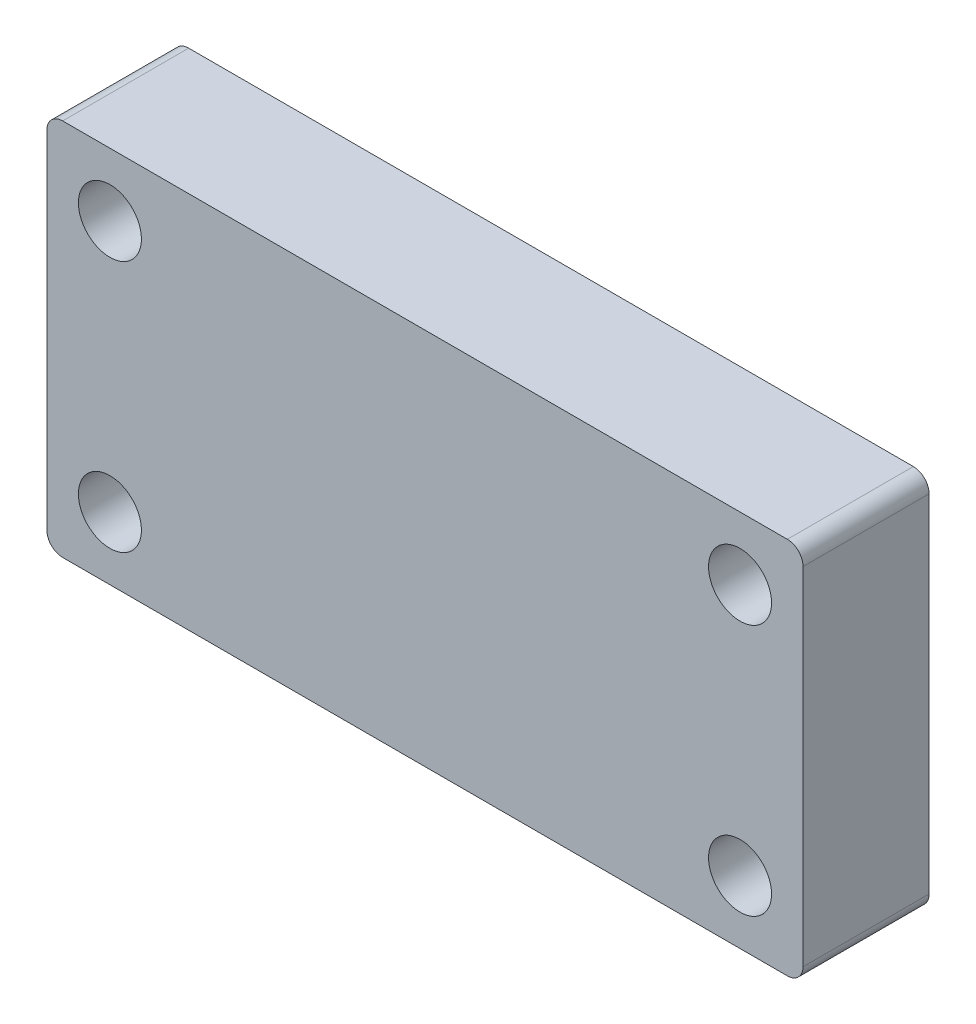
ISO-10303-21;
HEADER;
FILE_DESCRIPTION(('STEP AP214'),'2;1');
FILE_NAME('part.step','',(''),(''),'','','');
FILE_SCHEMA(('AUTOMOTIVE_DESIGN { 1 0 10303 214 1 1 1 1 }'));
ENDSEC;
DATA;
#1=APPLICATION_CONTEXT('core data for automotive mechanical design processes');
#2=APPLICATION_PROTOCOL_DEFINITION('international standard','automotive_design',2000,#1);
#3=PRODUCT_CONTEXT('',#1,'mechanical');
#4=PRODUCT('Part','Part','',(#3));
#5=PRODUCT_RELATED_PRODUCT_CATEGORY('part','',(#4));
#6=PRODUCT_DEFINITION_FORMATION('','',#4);
#7=PRODUCT_DEFINITION_CONTEXT('part definition',#1,'design');
#8=PRODUCT_DEFINITION('design','',#6,#7);
#9=PRODUCT_DEFINITION_SHAPE('','',#8);
#10=(LENGTH_UNIT() NAMED_UNIT(*) SI_UNIT(.MILLI.,.METRE.));
#11=(NAMED_UNIT(*) PLANE_ANGLE_UNIT() SI_UNIT($,.RADIAN.));
#12=(NAMED_UNIT(*) SI_UNIT($,.STERADIAN.) SOLID_ANGLE_UNIT());
#13=UNCERTAINTY_MEASURE_WITH_UNIT(LENGTH_MEASURE(1.E-05),#10,'distance_accuracy_value','');
#14=(GEOMETRIC_REPRESENTATION_CONTEXT(3) GLOBAL_UNCERTAINTY_ASSIGNED_CONTEXT((#13)) GLOBAL_UNIT_ASSIGNED_CONTEXT((#10,
#11,#12)) REPRESENTATION_CONTEXT('',''));
#15=CARTESIAN_POINT('',(0.,0.,0.));
#16=DIRECTION('',(0.,0.,1.));
#17=DIRECTION('',(1.,0.,0.));
#18=AXIS2_PLACEMENT_3D('',#15,#16,#17);
#19=CARTESIAN_POINT('',(9.525,4.7625,3.175));
#20=DIRECTION('',(-1.,0.,0.));
#21=DIRECTION('',(0.,-1.,0.));
#22=AXIS2_PLACEMENT_3D('',#19,#20,#21);
#23=PLANE('',#22);
#24=DIRECTION('',(0.,1.,0.));
#25=VECTOR('',#24,1.);
#26=CARTESIAN_POINT('',(9.525,4.7625,3.175));
#27=LINE('',#26,#25);
#28=CARTESIAN_POINT('',(9.525,-4.365625,3.175));
#29=VERTEX_POINT('',#28);
#30=CARTESIAN_POINT('',(9.525,4.365625,3.175));
#31=VERTEX_POINT('',#30);
#32=EDGE_CURVE('E120',#29,#31,#27,.T.);
#33=ORIENTED_EDGE('',*,*,#32,.F.);
#34=DIRECTION('',(0.,0.,-1.));
#35=VECTOR('',#34,1.);
#36=CARTESIAN_POINT('',(9.525,-4.365625,3.175));
#37=LINE('',#36,#35);
#38=CARTESIAN_POINT('',(9.525,-4.365625,0.));
#39=VERTEX_POINT('',#38);
#40=EDGE_CURVE('E105',#29,#39,#37,.T.);
#41=ORIENTED_EDGE('',*,*,#40,.T.);
#42=DIRECTION('',(0.,1.,0.));
#43=VECTOR('',#42,1.);
#44=CARTESIAN_POINT('',(9.525,4.7625,0.));
#45=LINE('',#44,#43);
#46=CARTESIAN_POINT('',(9.525,4.365625,0.));
#47=VERTEX_POINT('',#46);
#48=EDGE_CURVE('E117',#39,#47,#45,.T.);
#49=ORIENTED_EDGE('',*,*,#48,.T.);
#50=DIRECTION('',(0.,0.,-1.));
#51=VECTOR('',#50,1.);
#52=CARTESIAN_POINT('',(9.525,4.365625,3.175));
#53=LINE('',#52,#51);
#54=EDGE_CURVE('E122',#47,#31,#53,.F.);
#55=ORIENTED_EDGE('',*,*,#54,.T.);
#56=EDGE_LOOP('',(#33,#41,#49,#55));
#57=FACE_BOUND('',#56,.T.);
#58=ADVANCED_FACE('F35',(#57),#23,.F.);
#59=CARTESIAN_POINT('',(-9.525,4.7625,3.175));
#60=DIRECTION('',(0.,-1.,0.));
#61=DIRECTION('',(0.,0.,-1.));
#62=AXIS2_PLACEMENT_3D('',#59,#60,#61);
#63=PLANE('',#62);
#64=DIRECTION('',(-1.,0.,0.));
#65=VECTOR('',#64,1.);
#66=CARTESIAN_POINT('',(-9.525,4.7625,0.));
#67=LINE('',#66,#65);
#68=CARTESIAN_POINT('',(9.12812499999999,4.7625,0.));
#69=VERTEX_POINT('',#68);
#70=CARTESIAN_POINT('',(-9.128125,4.7625,0.));
#71=VERTEX_POINT('',#70);
#72=EDGE_CURVE('E126',#69,#71,#67,.T.);
#73=ORIENTED_EDGE('',*,*,#72,.T.);
#74=DIRECTION('',(0.,0.,-1.));
#75=VECTOR('',#74,1.);
#76=CARTESIAN_POINT('',(-9.128125,4.7625,3.175));
#77=LINE('',#76,#75);
#78=CARTESIAN_POINT('',(-9.128125,4.7625,3.175));
#79=VERTEX_POINT('',#78);
#80=EDGE_CURVE('E11',#71,#79,#77,.F.);
#81=ORIENTED_EDGE('',*,*,#80,.T.);
#82=DIRECTION('',(-1.,0.,0.));
#83=VECTOR('',#82,1.);
#84=CARTESIAN_POINT('',(-9.525,4.7625,3.175));
#85=LINE('',#84,#83);
#86=CARTESIAN_POINT('',(9.12812499999999,4.7625,3.175));
#87=VERTEX_POINT('',#86);
#88=EDGE_CURVE('E166',#87,#79,#85,.T.);
#89=ORIENTED_EDGE('',*,*,#88,.F.);
#90=DIRECTION('',(0.,0.,-1.));
#91=VECTOR('',#90,1.);
#92=CARTESIAN_POINT('',(9.128125,4.7625,3.175));
#93=LINE('',#92,#91);
#94=EDGE_CURVE('E43',#87,#69,#93,.T.);
#95=ORIENTED_EDGE('',*,*,#94,.T.);
#96=EDGE_LOOP('',(#73,#81,#89,#95));
#97=FACE_BOUND('',#96,.T.);
#98=ADVANCED_FACE('F164',(#97),#63,.F.);
#99=CARTESIAN_POINT('',(-9.525,4.7625,3.175));
#100=DIRECTION('',(1.,0.,0.));
#101=DIRECTION('',(0.,1.,0.));
#102=AXIS2_PLACEMENT_3D('',#99,#100,#101);
#103=PLANE('',#102);
#104=DIRECTION('',(0.,-1.,0.));
#105=VECTOR('',#104,1.);
#106=CARTESIAN_POINT('',(-9.525,4.7625,0.));
#107=LINE('',#106,#105);
#108=CARTESIAN_POINT('',(-9.525,4.365625,0.));
#109=VERTEX_POINT('',#108);
#110=CARTESIAN_POINT('',(-9.525,-4.365625,0.));
#111=VERTEX_POINT('',#110);
#112=EDGE_CURVE('E130',#109,#111,#107,.T.);
#113=ORIENTED_EDGE('',*,*,#112,.T.);
#114=DIRECTION('',(0.,0.,-1.));
#115=VECTOR('',#114,1.);
#116=CARTESIAN_POINT('',(-9.525,-4.365625,3.175));
#117=LINE('',#116,#115);
#118=CARTESIAN_POINT('',(-9.525,-4.365625,3.175));
#119=VERTEX_POINT('',#118);
#120=EDGE_CURVE('E50',#111,#119,#117,.F.);
#121=ORIENTED_EDGE('',*,*,#120,.T.);
#122=DIRECTION('',(0.,-1.,0.));
#123=VECTOR('',#122,1.);
#124=CARTESIAN_POINT('',(-9.525,4.7625,3.175));
#125=LINE('',#124,#123);
#126=CARTESIAN_POINT('',(-9.525,4.365625,3.175));
#127=VERTEX_POINT('',#126);
#128=EDGE_CURVE('E174',#127,#119,#125,.T.);
#129=ORIENTED_EDGE('',*,*,#128,.F.);
#130=DIRECTION('',(0.,0.,-1.));
#131=VECTOR('',#130,1.);
#132=CARTESIAN_POINT('',(-9.525,4.365625,3.175));
#133=LINE('',#132,#131);
#134=EDGE_CURVE('E157',#127,#109,#133,.T.);
#135=ORIENTED_EDGE('',*,*,#134,.T.);
#136=EDGE_LOOP('',(#113,#121,#129,#135));
#137=FACE_BOUND('',#136,.T.);
#138=ADVANCED_FACE('F173',(#137),#103,.F.);
#139=CARTESIAN_POINT('',(-9.525,-4.7625,3.175));
#140=DIRECTION('',(0.,1.,0.));
#141=DIRECTION('',(0.,0.,1.));
#142=AXIS2_PLACEMENT_3D('',#139,#140,#141);
#143=PLANE('',#142);
#144=DIRECTION('',(1.,0.,0.));
#145=VECTOR('',#144,1.);
#146=CARTESIAN_POINT('',(-9.525,-4.7625,0.));
#147=LINE('',#146,#145);
#148=CARTESIAN_POINT('',(-9.128125,-4.7625,0.));
#149=VERTEX_POINT('',#148);
#150=CARTESIAN_POINT('',(9.12812499999999,-4.7625,0.));
#151=VERTEX_POINT('',#150);
#152=EDGE_CURVE('E140',#149,#151,#147,.T.);
#153=ORIENTED_EDGE('',*,*,#152,.T.);
#154=DIRECTION('',(0.,0.,-1.));
#155=VECTOR('',#154,1.);
#156=CARTESIAN_POINT('',(9.128125,-4.7625,3.175));
#157=LINE('',#156,#155);
#158=CARTESIAN_POINT('',(9.12812499999999,-4.7625,3.175));
#159=VERTEX_POINT('',#158);
#160=EDGE_CURVE('E106',#151,#159,#157,.F.);
#161=ORIENTED_EDGE('',*,*,#160,.T.);
#162=DIRECTION('',(1.,0.,0.));
#163=VECTOR('',#162,1.);
#164=CARTESIAN_POINT('',(-9.525,-4.7625,3.175));
#165=LINE('',#164,#163);
#166=CARTESIAN_POINT('',(-9.128125,-4.7625,3.175));
#167=VERTEX_POINT('',#166);
#168=EDGE_CURVE('E136',#167,#159,#165,.T.);
#169=ORIENTED_EDGE('',*,*,#168,.F.);
#170=DIRECTION('',(0.,0.,-1.));
#171=VECTOR('',#170,1.);
#172=CARTESIAN_POINT('',(-9.128125,-4.7625,3.175));
#173=LINE('',#172,#171);
#174=EDGE_CURVE('E111',#167,#149,#173,.T.);
#175=ORIENTED_EDGE('',*,*,#174,.T.);
#176=EDGE_LOOP('',(#153,#161,#169,#175));
#177=FACE_BOUND('',#176,.T.);
#178=ADVANCED_FACE('F214',(#177),#143,.F.);
#179=CARTESIAN_POINT('',(0.,0.,3.175));
#180=DIRECTION('',(0.,0.,1.));
#181=DIRECTION('',(1.,0.,0.));
#182=AXIS2_PLACEMENT_3D('',#179,#180,#181);
#183=PLANE('',#182);
#184=CARTESIAN_POINT('',(7.9375,3.17499999999999,3.175));
#185=DIRECTION('',(0.,0.,1.));
#186=DIRECTION('',(-1.,0.,0.));
#187=AXIS2_PLACEMENT_3D('',#184,#185,#186);
#188=CIRCLE('',#187,0.793749999999999);
#189=CARTESIAN_POINT('',(7.14375,3.17499999999999,3.175));
#190=VERTEX_POINT('',#189);
#191=EDGE_CURVE('E183',#190,#190,#188,.T.);
#192=ORIENTED_EDGE('',*,*,#191,.F.);
#193=EDGE_LOOP('',(#192));
#194=FACE_BOUND('',#193,.T.);
#195=CARTESIAN_POINT('',(7.9375,-3.175,3.175));
#196=DIRECTION('',(0.,0.,1.));
#197=DIRECTION('',(1.,0.,0.));
#198=AXIS2_PLACEMENT_3D('',#195,#196,#197);
#199=CIRCLE('',#198,0.793749999999999);
#200=CARTESIAN_POINT('',(8.73125,-3.175,3.175));
#201=VERTEX_POINT('',#200);
#202=EDGE_CURVE('E189',#201,#201,#199,.T.);
#203=ORIENTED_EDGE('',*,*,#202,.F.);
#204=EDGE_LOOP('',(#203));
#205=FACE_BOUND('',#204,.T.);
#206=CARTESIAN_POINT('',(-7.9375,-3.175,3.175));
#207=DIRECTION('',(0.,0.,1.));
#208=DIRECTION('',(-1.,0.,0.));
#209=AXIS2_PLACEMENT_3D('',#206,#207,#208);
#210=CIRCLE('',#209,0.79375);
#211=CARTESIAN_POINT('',(-8.73125,-3.175,3.175));
#212=VERTEX_POINT('',#211);
#213=EDGE_CURVE('E195',#212,#212,#210,.T.);
#214=ORIENTED_EDGE('',*,*,#213,.F.);
#215=EDGE_LOOP('',(#214));
#216=FACE_BOUND('',#215,.T.);
#217=CARTESIAN_POINT('',(-7.9375,3.175,3.175));
#218=DIRECTION('',(0.,0.,1.));
#219=DIRECTION('',(1.,0.,0.));
#220=AXIS2_PLACEMENT_3D('',#217,#218,#219);
#221=CIRCLE('',#220,0.79375);
#222=CARTESIAN_POINT('',(-7.14375,3.175,3.175));
#223=VERTEX_POINT('',#222);
#224=EDGE_CURVE('E133',#223,#223,#221,.T.);
#225=ORIENTED_EDGE('',*,*,#224,.F.);
#226=EDGE_LOOP('',(#225));
#227=FACE_BOUND('',#226,.T.);
#228=ORIENTED_EDGE('',*,*,#168,.T.);
#229=CARTESIAN_POINT('',(9.128125,-4.365625,3.175));
#230=DIRECTION('',(0.,0.,1.));
#231=DIRECTION('',(1.,0.,0.));
#232=AXIS2_PLACEMENT_3D('',#229,#230,#231);
#233=CIRCLE('',#232,0.396875);
#234=EDGE_CURVE('E155',#159,#29,#233,.T.);
#235=ORIENTED_EDGE('',*,*,#234,.T.);
#236=ORIENTED_EDGE('',*,*,#32,.T.);
#237=CARTESIAN_POINT('',(9.128125,4.365625,3.175));
#238=DIRECTION('',(0.,0.,1.));
#239=DIRECTION('',(1.,0.,0.));
#240=AXIS2_PLACEMENT_3D('',#237,#238,#239);
#241=CIRCLE('',#240,0.396875);
#242=EDGE_CURVE('E150',#31,#87,#241,.T.);
#243=ORIENTED_EDGE('',*,*,#242,.T.);
#244=ORIENTED_EDGE('',*,*,#88,.T.);
#245=CARTESIAN_POINT('',(-9.128125,4.365625,3.175));
#246=DIRECTION('',(0.,0.,1.));
#247=DIRECTION('',(1.,0.,0.));
#248=AXIS2_PLACEMENT_3D('',#245,#246,#247);
#249=CIRCLE('',#248,0.396875);
#250=EDGE_CURVE('E57',#79,#127,#249,.T.);
#251=ORIENTED_EDGE('',*,*,#250,.T.);
#252=ORIENTED_EDGE('',*,*,#128,.T.);
#253=CARTESIAN_POINT('',(-9.128125,-4.365625,3.175));
#254=DIRECTION('',(0.,0.,1.));
#255=DIRECTION('',(1.,0.,0.));
#256=AXIS2_PLACEMENT_3D('',#253,#254,#255);
#257=CIRCLE('',#256,0.396875);
#258=EDGE_CURVE('E153',#119,#167,#257,.T.);
#259=ORIENTED_EDGE('',*,*,#258,.T.);
#260=EDGE_LOOP('',(#228,#235,#236,#243,#244,#251,#252,#259));
#261=FACE_BOUND('',#260,.T.);
#262=ADVANCED_FACE('F211',(#194,#205,#216,#227,#261),#183,.T.);
#263=CARTESIAN_POINT('',(0.,0.,0.));
#264=DIRECTION('',(0.,0.,1.));
#265=DIRECTION('',(1.,0.,0.));
#266=AXIS2_PLACEMENT_3D('',#263,#264,#265);
#267=PLANE('',#266);
#268=CARTESIAN_POINT('',(7.9375,3.17499999999999,0.));
#269=DIRECTION('',(0.,0.,1.));
#270=DIRECTION('',(-1.,0.,0.));
#271=AXIS2_PLACEMENT_3D('',#268,#269,#270);
#272=CIRCLE('',#271,0.793749999999999);
#273=CARTESIAN_POINT('',(7.14375,3.17499999999999,0.));
#274=VERTEX_POINT('',#273);
#275=EDGE_CURVE('E186',#274,#274,#272,.T.);
#276=ORIENTED_EDGE('',*,*,#275,.T.);
#277=EDGE_LOOP('',(#276));
#278=FACE_BOUND('',#277,.T.);
#279=CARTESIAN_POINT('',(7.9375,-3.175,0.));
#280=DIRECTION('',(0.,0.,1.));
#281=DIRECTION('',(1.,0.,0.));
#282=AXIS2_PLACEMENT_3D('',#279,#280,#281);
#283=CIRCLE('',#282,0.793749999999999);
#284=CARTESIAN_POINT('',(8.73125,-3.175,0.));
#285=VERTEX_POINT('',#284);
#286=EDGE_CURVE('E192',#285,#285,#283,.T.);
#287=ORIENTED_EDGE('',*,*,#286,.T.);
#288=EDGE_LOOP('',(#287));
#289=FACE_BOUND('',#288,.T.);
#290=CARTESIAN_POINT('',(-7.9375,-3.175,0.));
#291=DIRECTION('',(0.,0.,1.));
#292=DIRECTION('',(-1.,0.,0.));
#293=AXIS2_PLACEMENT_3D('',#290,#291,#292);
#294=CIRCLE('',#293,0.79375);
#295=CARTESIAN_POINT('',(-8.73125,-3.175,0.));
#296=VERTEX_POINT('',#295);
#297=EDGE_CURVE('E181',#296,#296,#294,.T.);
#298=ORIENTED_EDGE('',*,*,#297,.T.);
#299=EDGE_LOOP('',(#298));
#300=FACE_BOUND('',#299,.T.);
#301=CARTESIAN_POINT('',(-7.9375,3.175,0.));
#302=DIRECTION('',(0.,0.,1.));
#303=DIRECTION('',(1.,0.,0.));
#304=AXIS2_PLACEMENT_3D('',#301,#302,#303);
#305=CIRCLE('',#304,0.79375);
#306=CARTESIAN_POINT('',(-7.14375,3.175,0.));
#307=VERTEX_POINT('',#306);
#308=EDGE_CURVE('E127',#307,#307,#305,.T.);
#309=ORIENTED_EDGE('',*,*,#308,.T.);
#310=EDGE_LOOP('',(#309));
#311=FACE_BOUND('',#310,.T.);
#312=ORIENTED_EDGE('',*,*,#48,.F.);
#313=CARTESIAN_POINT('',(9.128125,-4.365625,0.));
#314=DIRECTION('',(0.,0.,1.));
#315=DIRECTION('',(1.,0.,0.));
#316=AXIS2_PLACEMENT_3D('',#313,#314,#315);
#317=CIRCLE('',#316,0.396875);
#318=EDGE_CURVE('E101',#39,#151,#317,.F.);
#319=ORIENTED_EDGE('',*,*,#318,.T.);
#320=ORIENTED_EDGE('',*,*,#152,.F.);
#321=CARTESIAN_POINT('',(-9.128125,-4.365625,0.));
#322=DIRECTION('',(0.,0.,1.));
#323=DIRECTION('',(1.,0.,0.));
#324=AXIS2_PLACEMENT_3D('',#321,#322,#323);
#325=CIRCLE('',#324,0.396875);
#326=EDGE_CURVE('E112',#149,#111,#325,.F.);
#327=ORIENTED_EDGE('',*,*,#326,.T.);
#328=ORIENTED_EDGE('',*,*,#112,.F.);
#329=CARTESIAN_POINT('',(-9.128125,4.365625,0.));
#330=DIRECTION('',(0.,0.,1.));
#331=DIRECTION('',(1.,0.,0.));
#332=AXIS2_PLACEMENT_3D('',#329,#330,#331);
#333=CIRCLE('',#332,0.396875);
#334=EDGE_CURVE('E144',#109,#71,#333,.F.);
#335=ORIENTED_EDGE('',*,*,#334,.T.);
#336=ORIENTED_EDGE('',*,*,#72,.F.);
#337=CARTESIAN_POINT('',(9.128125,4.365625,0.));
#338=DIRECTION('',(0.,0.,1.));
#339=DIRECTION('',(1.,0.,0.));
#340=AXIS2_PLACEMENT_3D('',#337,#338,#339);
#341=CIRCLE('',#340,0.396875);
#342=EDGE_CURVE('E121',#69,#47,#341,.F.);
#343=ORIENTED_EDGE('',*,*,#342,.T.);
#344=EDGE_LOOP('',(#312,#319,#320,#327,#328,#335,#336,#343));
#345=FACE_BOUND('',#344,.T.);
#346=ADVANCED_FACE('F124',(#278,#289,#300,#311,#345),#267,.F.);
#347=CARTESIAN_POINT('',(-7.9375,3.175,0.));
#348=DIRECTION('',(0.,0.,1.));
#349=DIRECTION('',(1.,0.,0.));
#350=AXIS2_PLACEMENT_3D('',#347,#348,#349);
#351=CYLINDRICAL_SURFACE('',#350,0.79375);
#352=ORIENTED_EDGE('',*,*,#308,.F.);
#353=EDGE_LOOP('',(#352));
#354=FACE_BOUND('',#353,.T.);
#355=ORIENTED_EDGE('',*,*,#224,.T.);
#356=EDGE_LOOP('',(#355));
#357=FACE_BOUND('',#356,.T.);
#358=ADVANCED_FACE('F207',(#354,#357),#351,.F.);
#359=CARTESIAN_POINT('',(-7.9375,-3.175,0.));
#360=DIRECTION('',(0.,0.,1.));
#361=DIRECTION('',(1.,0.,0.));
#362=AXIS2_PLACEMENT_3D('',#359,#360,#361);
#363=CYLINDRICAL_SURFACE('',#362,0.79375);
#364=ORIENTED_EDGE('',*,*,#297,.F.);
#365=EDGE_LOOP('',(#364));
#366=FACE_BOUND('',#365,.T.);
#367=ORIENTED_EDGE('',*,*,#213,.T.);
#368=EDGE_LOOP('',(#367));
#369=FACE_BOUND('',#368,.T.);
#370=ADVANCED_FACE('F203',(#366,#369),#363,.F.);
#371=CARTESIAN_POINT('',(7.9375,-3.175,0.));
#372=DIRECTION('',(0.,0.,1.));
#373=DIRECTION('',(1.,0.,0.));
#374=AXIS2_PLACEMENT_3D('',#371,#372,#373);
#375=CYLINDRICAL_SURFACE('',#374,0.793749999999999);
#376=ORIENTED_EDGE('',*,*,#286,.F.);
#377=EDGE_LOOP('',(#376));
#378=FACE_BOUND('',#377,.T.);
#379=ORIENTED_EDGE('',*,*,#202,.T.);
#380=EDGE_LOOP('',(#379));
#381=FACE_BOUND('',#380,.T.);
#382=ADVANCED_FACE('F206',(#378,#381),#375,.F.);
#383=CARTESIAN_POINT('',(7.9375,3.17499999999999,0.));
#384=DIRECTION('',(0.,0.,1.));
#385=DIRECTION('',(1.,0.,0.));
#386=AXIS2_PLACEMENT_3D('',#383,#384,#385);
#387=CYLINDRICAL_SURFACE('',#386,0.793749999999999);
#388=ORIENTED_EDGE('',*,*,#275,.F.);
#389=EDGE_LOOP('',(#388));
#390=FACE_BOUND('',#389,.T.);
#391=ORIENTED_EDGE('',*,*,#191,.T.);
#392=EDGE_LOOP('',(#391));
#393=FACE_BOUND('',#392,.T.);
#394=ADVANCED_FACE('F229',(#390,#393),#387,.F.);
#395=CARTESIAN_POINT('',(9.128125,-4.365625,3.175));
#396=DIRECTION('',(0.,0.,-1.));
#397=DIRECTION('',(-1.,0.,0.));
#398=AXIS2_PLACEMENT_3D('',#395,#396,#397);
#399=CYLINDRICAL_SURFACE('',#398,0.396875);
#400=ORIENTED_EDGE('',*,*,#234,.F.);
#401=ORIENTED_EDGE('',*,*,#160,.F.);
#402=ORIENTED_EDGE('',*,*,#318,.F.);
#403=ORIENTED_EDGE('',*,*,#40,.F.);
#404=EDGE_LOOP('',(#400,#401,#402,#403));
#405=FACE_BOUND('',#404,.T.);
#406=ADVANCED_FACE('F104',(#405),#399,.T.);
#407=CARTESIAN_POINT('',(-9.128125,-4.365625,3.175));
#408=DIRECTION('',(0.,0.,-1.));
#409=DIRECTION('',(-1.,0.,0.));
#410=AXIS2_PLACEMENT_3D('',#407,#408,#409);
#411=CYLINDRICAL_SURFACE('',#410,0.396875);
#412=ORIENTED_EDGE('',*,*,#258,.F.);
#413=ORIENTED_EDGE('',*,*,#120,.F.);
#414=ORIENTED_EDGE('',*,*,#326,.F.);
#415=ORIENTED_EDGE('',*,*,#174,.F.);
#416=EDGE_LOOP('',(#412,#413,#414,#415));
#417=FACE_BOUND('',#416,.T.);
#418=ADVANCED_FACE('F222',(#417),#411,.T.);
#419=CARTESIAN_POINT('',(-9.128125,4.365625,3.175));
#420=DIRECTION('',(0.,0.,-1.));
#421=DIRECTION('',(-1.,0.,0.));
#422=AXIS2_PLACEMENT_3D('',#419,#420,#421);
#423=CYLINDRICAL_SURFACE('',#422,0.396875);
#424=ORIENTED_EDGE('',*,*,#250,.F.);
#425=ORIENTED_EDGE('',*,*,#80,.F.);
#426=ORIENTED_EDGE('',*,*,#334,.F.);
#427=ORIENTED_EDGE('',*,*,#134,.F.);
#428=EDGE_LOOP('',(#424,#425,#426,#427));
#429=FACE_BOUND('',#428,.T.);
#430=ADVANCED_FACE('F172',(#429),#423,.T.);
#431=CARTESIAN_POINT('',(9.128125,4.365625,3.175));
#432=DIRECTION('',(0.,0.,-1.));
#433=DIRECTION('',(-1.,0.,0.));
#434=AXIS2_PLACEMENT_3D('',#431,#432,#433);
#435=CYLINDRICAL_SURFACE('',#434,0.396875);
#436=ORIENTED_EDGE('',*,*,#242,.F.);
#437=ORIENTED_EDGE('',*,*,#54,.F.);
#438=ORIENTED_EDGE('',*,*,#342,.F.);
#439=ORIENTED_EDGE('',*,*,#94,.F.);
#440=EDGE_LOOP('',(#436,#437,#438,#439));
#441=FACE_BOUND('',#440,.T.);
#442=ADVANCED_FACE('F37',(#441),#435,.T.);
#443=CLOSED_SHELL('',(#58,#98,#138,#178,#262,#346,#358,#370,#382,#394,#406,#418,#430,#442));
#444=MANIFOLD_SOLID_BREP('B2',#443);
#445=ADVANCED_BREP_SHAPE_REPRESENTATION('',(#18,#444),#14);
#446=SHAPE_DEFINITION_REPRESENTATION(#9,#445);
ENDSEC;
END-ISO-10303-21;
